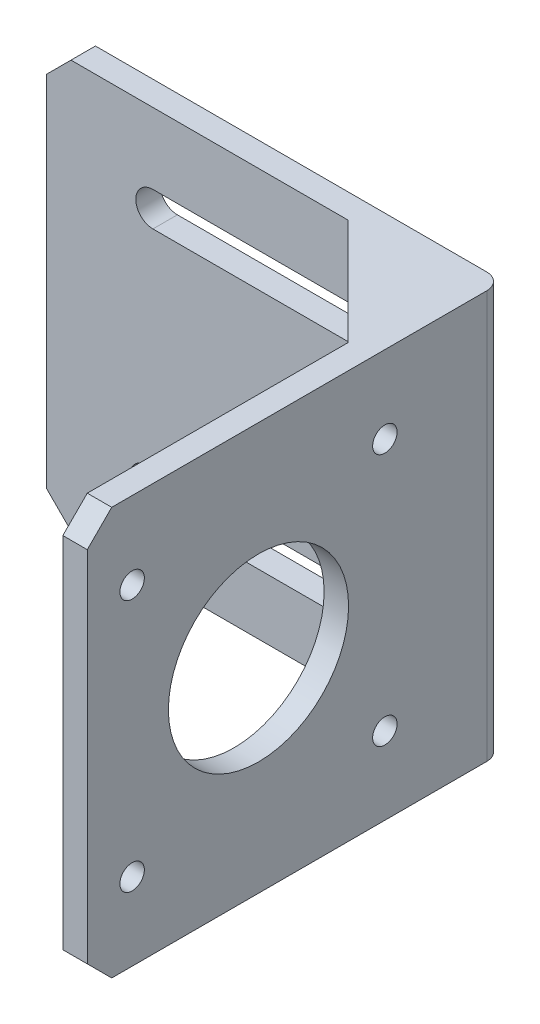
ISO-10303-21;
HEADER;
FILE_DESCRIPTION(('STEP AP214'),'2;1');
FILE_NAME('part.step','',(''),(''),'','','');
FILE_SCHEMA(('AUTOMOTIVE_DESIGN { 1 0 10303 214 1 1 1 1 }'));
ENDSEC;
DATA;
#1=APPLICATION_CONTEXT('core data for automotive mechanical design processes');
#2=APPLICATION_PROTOCOL_DEFINITION('international standard','automotive_design',2000,#1);
#3=PRODUCT_CONTEXT('',#1,'mechanical');
#4=PRODUCT('Part','Part','',(#3));
#5=PRODUCT_RELATED_PRODUCT_CATEGORY('part','',(#4));
#6=PRODUCT_DEFINITION_FORMATION('','',#4);
#7=PRODUCT_DEFINITION_CONTEXT('part definition',#1,'design');
#8=PRODUCT_DEFINITION('design','',#6,#7);
#9=PRODUCT_DEFINITION_SHAPE('','',#8);
#10=(LENGTH_UNIT() NAMED_UNIT(*) SI_UNIT(.MILLI.,.METRE.));
#11=(NAMED_UNIT(*) PLANE_ANGLE_UNIT() SI_UNIT($,.RADIAN.));
#12=(NAMED_UNIT(*) SI_UNIT($,.STERADIAN.) SOLID_ANGLE_UNIT());
#13=UNCERTAINTY_MEASURE_WITH_UNIT(LENGTH_MEASURE(1.E-05),#10,'distance_accuracy_value','');
#14=(GEOMETRIC_REPRESENTATION_CONTEXT(3) GLOBAL_UNCERTAINTY_ASSIGNED_CONTEXT((#13)) GLOBAL_UNIT_ASSIGNED_CONTEXT((#10,
#11,#12)) REPRESENTATION_CONTEXT('',''));
#15=CARTESIAN_POINT('',(0.,0.,0.));
#16=DIRECTION('',(0.,0.,1.));
#17=DIRECTION('',(1.,0.,0.));
#18=AXIS2_PLACEMENT_3D('',#15,#16,#17);
#19=CARTESIAN_POINT('',(0.,0.,3.));
#20=DIRECTION('',(0.,0.,-1.));
#21=DIRECTION('',(-1.,0.,0.));
#22=AXIS2_PLACEMENT_3D('',#19,#20,#21);
#23=PLANE('',#22);
#24=DIRECTION('',(-1.,0.,0.));
#25=VECTOR('',#24,1.);
#26=CARTESIAN_POINT('',(16.5517923782079,16.2937593808742,3.));
#27=LINE('',#26,#25);
#28=CARTESIAN_POINT('',(16.5517923782079,16.2937593808742,3.));
#29=VERTEX_POINT('',#28);
#30=CARTESIAN_POINT('',(-13.4482076217921,16.2937593808742,3.));
#31=VERTEX_POINT('',#30);
#32=EDGE_CURVE('E220',#29,#31,#27,.T.);
#33=ORIENTED_EDGE('',*,*,#32,.F.);
#34=CARTESIAN_POINT('',(16.5517923782079,14.1937593808742,3.));
#35=DIRECTION('',(0.,0.,1.));
#36=DIRECTION('',(1.,0.,0.));
#37=AXIS2_PLACEMENT_3D('',#34,#35,#36);
#38=CIRCLE('',#37,2.1);
#39=CARTESIAN_POINT('',(16.5517923782079,12.0937593808742,3.));
#40=VERTEX_POINT('',#39);
#41=EDGE_CURVE('E51',#40,#29,#38,.T.);
#42=ORIENTED_EDGE('',*,*,#41,.F.);
#43=DIRECTION('',(1.,0.,0.));
#44=VECTOR('',#43,1.);
#45=CARTESIAN_POINT('',(16.5517923782079,12.0937593808742,3.));
#46=LINE('',#45,#44);
#47=CARTESIAN_POINT('',(-13.4482076217921,12.0937593808742,3.));
#48=VERTEX_POINT('',#47);
#49=EDGE_CURVE('E211',#48,#40,#46,.T.);
#50=ORIENTED_EDGE('',*,*,#49,.F.);
#51=CARTESIAN_POINT('',(-13.4482076217921,14.1937593808742,3.));
#52=DIRECTION('',(0.,0.,1.));
#53=DIRECTION('',(1.,0.,0.));
#54=AXIS2_PLACEMENT_3D('',#51,#52,#53);
#55=CIRCLE('',#54,2.1);
#56=EDGE_CURVE('E214',#31,#48,#55,.T.);
#57=ORIENTED_EDGE('',*,*,#56,.F.);
#58=EDGE_LOOP('',(#33,#42,#50,#57));
#59=FACE_BOUND('',#58,.T.);
#60=DIRECTION('',(-1.,0.,0.));
#61=VECTOR('',#60,1.);
#62=CARTESIAN_POINT('',(15.8289488197727,-13.3772342948045,3.));
#63=LINE('',#62,#61);
#64=CARTESIAN_POINT('',(15.8289488197727,-13.3772342948045,3.));
#65=VERTEX_POINT('',#64);
#66=CARTESIAN_POINT('',(-14.1710511802273,-13.3772342948045,3.));
#67=VERTEX_POINT('',#66);
#68=EDGE_CURVE('E246',#65,#67,#63,.T.);
#69=ORIENTED_EDGE('',*,*,#68,.F.);
#70=CARTESIAN_POINT('',(15.8289488197727,-15.4772342948045,3.));
#71=DIRECTION('',(0.,0.,1.));
#72=DIRECTION('',(1.,0.,0.));
#73=AXIS2_PLACEMENT_3D('',#70,#71,#72);
#74=CIRCLE('',#73,2.1);
#75=CARTESIAN_POINT('',(15.8289488197727,-17.5772342948045,3.));
#76=VERTEX_POINT('',#75);
#77=EDGE_CURVE('E59',#76,#65,#74,.T.);
#78=ORIENTED_EDGE('',*,*,#77,.F.);
#79=DIRECTION('',(1.,0.,0.));
#80=VECTOR('',#79,1.);
#81=CARTESIAN_POINT('',(15.8289488197727,-17.5772342948045,3.));
#82=LINE('',#81,#80);
#83=CARTESIAN_POINT('',(-14.1710511802273,-17.5772342948045,3.));
#84=VERTEX_POINT('',#83);
#85=EDGE_CURVE('E235',#84,#76,#82,.T.);
#86=ORIENTED_EDGE('',*,*,#85,.F.);
#87=CARTESIAN_POINT('',(-14.1710511802273,-15.4772342948045,3.));
#88=DIRECTION('',(0.,0.,1.));
#89=DIRECTION('',(1.,0.,0.));
#90=AXIS2_PLACEMENT_3D('',#87,#88,#89);
#91=CIRCLE('',#90,2.1);
#92=EDGE_CURVE('E249',#67,#84,#91,.T.);
#93=ORIENTED_EDGE('',*,*,#92,.F.);
#94=EDGE_LOOP('',(#69,#78,#86,#93));
#95=FACE_BOUND('',#94,.T.);
#96=DIRECTION('',(1.,0.,0.));
#97=VECTOR('',#96,1.);
#98=CARTESIAN_POINT('',(-26.5,-25.,3.));
#99=LINE('',#98,#97);
#100=CARTESIAN_POINT('',(-23.5,-25.,3.));
#101=VERTEX_POINT('',#100);
#102=CARTESIAN_POINT('',(10.5,-25.,3.));
#103=VERTEX_POINT('',#102);
#104=EDGE_CURVE('E341',#101,#103,#99,.T.);
#105=ORIENTED_EDGE('',*,*,#104,.T.);
#106=DIRECTION('',(0.,-1.,0.));
#107=VECTOR('',#106,1.);
#108=CARTESIAN_POINT('',(10.5,-22.,3.));
#109=LINE('',#108,#107);
#110=CARTESIAN_POINT('',(10.5,-22.,3.));
#111=VERTEX_POINT('',#110);
#112=EDGE_CURVE('E272',#111,#103,#109,.T.);
#113=ORIENTED_EDGE('',*,*,#112,.F.);
#114=DIRECTION('',(1.,0.,0.));
#115=VECTOR('',#114,1.);
#116=CARTESIAN_POINT('',(10.5,-22.,3.));
#117=LINE('',#116,#115);
#118=CARTESIAN_POINT('',(23.5,-22.,3.));
#119=VERTEX_POINT('',#118);
#120=EDGE_CURVE('E260',#111,#119,#117,.T.);
#121=ORIENTED_EDGE('',*,*,#120,.T.);
#122=DIRECTION('',(0.,-1.,0.));
#123=VECTOR('',#122,1.);
#124=CARTESIAN_POINT('',(23.5,-25.,3.));
#125=LINE('',#124,#123);
#126=CARTESIAN_POINT('',(23.5,22.,3.));
#127=VERTEX_POINT('',#126);
#128=EDGE_CURVE('E321',#127,#119,#125,.T.);
#129=ORIENTED_EDGE('',*,*,#128,.F.);
#130=DIRECTION('',(-1.,0.,0.));
#131=VECTOR('',#130,1.);
#132=CARTESIAN_POINT('',(10.5,22.,3.));
#133=LINE('',#132,#131);
#134=CARTESIAN_POINT('',(10.5,22.,3.));
#135=VERTEX_POINT('',#134);
#136=EDGE_CURVE('E279',#127,#135,#133,.T.);
#137=ORIENTED_EDGE('',*,*,#136,.T.);
#138=DIRECTION('',(0.,1.,0.));
#139=VECTOR('',#138,1.);
#140=CARTESIAN_POINT('',(10.5,22.,3.));
#141=LINE('',#140,#139);
#142=CARTESIAN_POINT('',(10.5,25.,3.));
#143=VERTEX_POINT('',#142);
#144=EDGE_CURVE('E284',#135,#143,#141,.T.);
#145=ORIENTED_EDGE('',*,*,#144,.T.);
#146=DIRECTION('',(-1.,0.,0.));
#147=VECTOR('',#146,1.);
#148=CARTESIAN_POINT('',(-26.5,25.,3.));
#149=LINE('',#148,#147);
#150=CARTESIAN_POINT('',(-23.5,25.,3.));
#151=VERTEX_POINT('',#150);
#152=EDGE_CURVE('E335',#143,#151,#149,.T.);
#153=ORIENTED_EDGE('',*,*,#152,.T.);
#154=DIRECTION('',(0.707106781186548,0.707106781186548,0.));
#155=VECTOR('',#154,1.);
#156=CARTESIAN_POINT('',(-26.5,22.,3.));
#157=LINE('',#156,#155);
#158=CARTESIAN_POINT('',(-26.5,22.,3.));
#159=VERTEX_POINT('',#158);
#160=EDGE_CURVE('E379',#151,#159,#157,.F.);
#161=ORIENTED_EDGE('',*,*,#160,.T.);
#162=DIRECTION('',(0.,-1.,0.));
#163=VECTOR('',#162,1.);
#164=CARTESIAN_POINT('',(-26.5,-25.,3.));
#165=LINE('',#164,#163);
#166=CARTESIAN_POINT('',(-26.5,-22.,3.));
#167=VERTEX_POINT('',#166);
#168=EDGE_CURVE('E337',#159,#167,#165,.T.);
#169=ORIENTED_EDGE('',*,*,#168,.T.);
#170=DIRECTION('',(-0.707106781186548,0.707106781186548,0.));
#171=VECTOR('',#170,1.);
#172=CARTESIAN_POINT('',(-23.5,-25.,3.));
#173=LINE('',#172,#171);
#174=EDGE_CURVE('E381',#167,#101,#173,.F.);
#175=ORIENTED_EDGE('',*,*,#174,.T.);
#176=EDGE_LOOP('',(#105,#113,#121,#129,#137,#145,#153,#161,#169,#175));
#177=FACE_BOUND('',#176,.T.);
#178=ADVANCED_FACE('F36',(#59,#95,#177),#23,.F.);
#179=CARTESIAN_POINT('',(26.5,-25.,3.));
#180=DIRECTION('',(-1.,0.,0.));
#181=DIRECTION('',(0.,0.,1.));
#182=AXIS2_PLACEMENT_3D('',#179,#180,#181);
#183=PLANE('',#182);
#184=CARTESIAN_POINT('',(26.5,15.5,14.5));
#185=DIRECTION('',(1.,0.,0.));
#186=DIRECTION('',(0.,0.,-1.));
#187=AXIS2_PLACEMENT_3D('',#184,#185,#186);
#188=CIRCLE('',#187,1.5);
#189=CARTESIAN_POINT('',(26.5,15.5,13.));
#190=VERTEX_POINT('',#189);
#191=EDGE_CURVE('E290',#190,#190,#188,.T.);
#192=ORIENTED_EDGE('',*,*,#191,.F.);
#193=EDGE_LOOP('',(#192));
#194=FACE_BOUND('',#193,.T.);
#195=CARTESIAN_POINT('',(26.5,-15.5,14.5));
#196=DIRECTION('',(1.,0.,0.));
#197=DIRECTION('',(0.,0.,-1.));
#198=AXIS2_PLACEMENT_3D('',#195,#196,#197);
#199=CIRCLE('',#198,1.5);
#200=CARTESIAN_POINT('',(26.5,-15.5,13.));
#201=VERTEX_POINT('',#200);
#202=EDGE_CURVE('E297',#201,#201,#199,.T.);
#203=ORIENTED_EDGE('',*,*,#202,.F.);
#204=EDGE_LOOP('',(#203));
#205=FACE_BOUND('',#204,.T.);
#206=CARTESIAN_POINT('',(26.5,-15.5,45.5));
#207=DIRECTION('',(1.,0.,0.));
#208=DIRECTION('',(0.,0.,-1.));
#209=AXIS2_PLACEMENT_3D('',#206,#207,#208);
#210=CIRCLE('',#209,1.5);
#211=CARTESIAN_POINT('',(26.5,-15.5,44.));
#212=VERTEX_POINT('',#211);
#213=EDGE_CURVE('E303',#212,#212,#210,.T.);
#214=ORIENTED_EDGE('',*,*,#213,.F.);
#215=EDGE_LOOP('',(#214));
#216=FACE_BOUND('',#215,.T.);
#217=CARTESIAN_POINT('',(26.5,15.5,45.5));
#218=DIRECTION('',(1.,0.,0.));
#219=DIRECTION('',(0.,0.,-1.));
#220=AXIS2_PLACEMENT_3D('',#217,#218,#219);
#221=CIRCLE('',#220,1.5);
#222=CARTESIAN_POINT('',(26.5,15.5,44.));
#223=VERTEX_POINT('',#222);
#224=EDGE_CURVE('E309',#223,#223,#221,.T.);
#225=ORIENTED_EDGE('',*,*,#224,.F.);
#226=EDGE_LOOP('',(#225));
#227=FACE_BOUND('',#226,.T.);
#228=CARTESIAN_POINT('',(26.5,0.,30.));
#229=DIRECTION('',(1.,0.,0.));
#230=DIRECTION('',(0.,0.,-1.));
#231=AXIS2_PLACEMENT_3D('',#228,#229,#230);
#232=CIRCLE('',#231,11.05);
#233=CARTESIAN_POINT('',(26.5,0.,18.95));
#234=VERTEX_POINT('',#233);
#235=EDGE_CURVE('E315',#234,#234,#232,.T.);
#236=ORIENTED_EDGE('',*,*,#235,.F.);
#237=EDGE_LOOP('',(#236));
#238=FACE_BOUND('',#237,.T.);
#239=DIRECTION('',(0.,0.,-1.));
#240=VECTOR('',#239,1.);
#241=CARTESIAN_POINT('',(26.5,25.,3.));
#242=LINE('',#241,#240);
#243=CARTESIAN_POINT('',(26.5,25.,48.));
#244=VERTEX_POINT('',#243);
#245=CARTESIAN_POINT('',(26.5,25.,2.));
#246=VERTEX_POINT('',#245);
#247=EDGE_CURVE('E352',#244,#246,#242,.T.);
#248=ORIENTED_EDGE('',*,*,#247,.F.);
#249=DIRECTION('',(0.,-0.707106781186546,0.707106781186549));
#250=VECTOR('',#249,1.);
#251=CARTESIAN_POINT('',(26.5,22.,51.));
#252=LINE('',#251,#250);
#253=CARTESIAN_POINT('',(26.5,22.,51.));
#254=VERTEX_POINT('',#253);
#255=EDGE_CURVE('E11',#244,#254,#252,.T.);
#256=ORIENTED_EDGE('',*,*,#255,.T.);
#257=DIRECTION('',(0.,1.,0.));
#258=VECTOR('',#257,1.);
#259=CARTESIAN_POINT('',(26.5,-25.,51.));
#260=LINE('',#259,#258);
#261=CARTESIAN_POINT('',(26.5,-22.,51.));
#262=VERTEX_POINT('',#261);
#263=EDGE_CURVE('E322',#262,#254,#260,.T.);
#264=ORIENTED_EDGE('',*,*,#263,.F.);
#265=DIRECTION('',(0.,-0.707106781186546,-0.707106781186549));
#266=VECTOR('',#265,1.);
#267=CARTESIAN_POINT('',(26.5,-22.,51.));
#268=LINE('',#267,#266);
#269=CARTESIAN_POINT('',(26.5,-25.,48.));
#270=VERTEX_POINT('',#269);
#271=EDGE_CURVE('E389',#262,#270,#268,.T.);
#272=ORIENTED_EDGE('',*,*,#271,.T.);
#273=DIRECTION('',(0.,0.,-1.));
#274=VECTOR('',#273,1.);
#275=CARTESIAN_POINT('',(26.5,-25.,3.));
#276=LINE('',#275,#274);
#277=CARTESIAN_POINT('',(26.5,-25.,2.));
#278=VERTEX_POINT('',#277);
#279=EDGE_CURVE('E344',#270,#278,#276,.T.);
#280=ORIENTED_EDGE('',*,*,#279,.T.);
#281=DIRECTION('',(0.,1.,0.));
#282=VECTOR('',#281,1.);
#283=CARTESIAN_POINT('',(26.5,25.,2.));
#284=LINE('',#283,#282);
#285=EDGE_CURVE('E354',#278,#246,#284,.T.);
#286=ORIENTED_EDGE('',*,*,#285,.T.);
#287=EDGE_LOOP('',(#248,#256,#264,#272,#280,#286));
#288=FACE_BOUND('',#287,.T.);
#289=ADVANCED_FACE('F408',(#194,#205,#216,#227,#238,#288),#183,.F.);
#290=CARTESIAN_POINT('',(-26.5,25.,3.));
#291=DIRECTION('',(0.,-1.,0.));
#292=DIRECTION('',(0.,0.,-1.));
#293=AXIS2_PLACEMENT_3D('',#290,#291,#292);
#294=PLANE('',#293);
#295=ORIENTED_EDGE('',*,*,#152,.F.);
#296=DIRECTION('',(0.707106781186547,0.,0.707106781186548));
#297=VECTOR('',#296,1.);
#298=CARTESIAN_POINT('',(23.5,25.,16.));
#299=LINE('',#298,#297);
#300=CARTESIAN_POINT('',(23.5,25.,16.));
#301=VERTEX_POINT('',#300);
#302=EDGE_CURVE('E274',#143,#301,#299,.T.);
#303=ORIENTED_EDGE('',*,*,#302,.T.);
#304=DIRECTION('',(0.,0.,-1.));
#305=VECTOR('',#304,1.);
#306=CARTESIAN_POINT('',(23.5,25.,51.));
#307=LINE('',#306,#305);
#308=CARTESIAN_POINT('',(23.5,25.,48.));
#309=VERTEX_POINT('',#308);
#310=EDGE_CURVE('E332',#309,#301,#307,.T.);
#311=ORIENTED_EDGE('',*,*,#310,.F.);
#312=DIRECTION('',(1.,0.,0.));
#313=VECTOR('',#312,1.);
#314=CARTESIAN_POINT('',(26.5,25.,48.));
#315=LINE('',#314,#313);
#316=EDGE_CURVE('E44',#309,#244,#315,.T.);
#317=ORIENTED_EDGE('',*,*,#316,.T.);
#318=ORIENTED_EDGE('',*,*,#247,.T.);
#319=CARTESIAN_POINT('',(24.5,25.,2.));
#320=DIRECTION('',(0.,-1.,0.));
#321=DIRECTION('',(0.,0.,-1.));
#322=AXIS2_PLACEMENT_3D('',#319,#320,#321);
#323=CIRCLE('',#322,2.);
#324=CARTESIAN_POINT('',(24.5,25.,0.));
#325=VERTEX_POINT('',#324);
#326=EDGE_CURVE('E357',#246,#325,#323,.F.);
#327=ORIENTED_EDGE('',*,*,#326,.T.);
#328=DIRECTION('',(-1.,0.,0.));
#329=VECTOR('',#328,1.);
#330=CARTESIAN_POINT('',(-26.5,25.,0.));
#331=LINE('',#330,#329);
#332=CARTESIAN_POINT('',(-23.5,25.,0.));
#333=VERTEX_POINT('',#332);
#334=EDGE_CURVE('E334',#325,#333,#331,.T.);
#335=ORIENTED_EDGE('',*,*,#334,.T.);
#336=DIRECTION('',(0.,0.,1.));
#337=VECTOR('',#336,1.);
#338=CARTESIAN_POINT('',(-23.5,25.,3.));
#339=LINE('',#338,#337);
#340=EDGE_CURVE('E383',#333,#151,#339,.T.);
#341=ORIENTED_EDGE('',*,*,#340,.T.);
#342=EDGE_LOOP('',(#295,#303,#311,#317,#318,#327,#335,#341));
#343=FACE_BOUND('',#342,.T.);
#344=ADVANCED_FACE('F403',(#343),#294,.F.);
#345=CARTESIAN_POINT('',(-26.5,-25.,3.));
#346=DIRECTION('',(1.,0.,0.));
#347=DIRECTION('',(0.,0.,-1.));
#348=AXIS2_PLACEMENT_3D('',#345,#346,#347);
#349=PLANE('',#348);
#350=DIRECTION('',(0.,-1.,0.));
#351=VECTOR('',#350,1.);
#352=CARTESIAN_POINT('',(-26.5,-25.,0.));
#353=LINE('',#352,#351);
#354=CARTESIAN_POINT('',(-26.5,22.,0.));
#355=VERTEX_POINT('',#354);
#356=CARTESIAN_POINT('',(-26.5,-22.,0.));
#357=VERTEX_POINT('',#356);
#358=EDGE_CURVE('E347',#355,#357,#353,.T.);
#359=ORIENTED_EDGE('',*,*,#358,.T.);
#360=DIRECTION('',(0.,0.,1.));
#361=VECTOR('',#360,1.);
#362=CARTESIAN_POINT('',(-26.5,-22.,3.));
#363=LINE('',#362,#361);
#364=EDGE_CURVE('E377',#357,#167,#363,.T.);
#365=ORIENTED_EDGE('',*,*,#364,.T.);
#366=ORIENTED_EDGE('',*,*,#168,.F.);
#367=DIRECTION('',(0.,0.,-1.));
#368=VECTOR('',#367,1.);
#369=CARTESIAN_POINT('',(-26.5,22.,3.));
#370=LINE('',#369,#368);
#371=EDGE_CURVE('E374',#159,#355,#370,.T.);
#372=ORIENTED_EDGE('',*,*,#371,.T.);
#373=EDGE_LOOP('',(#359,#365,#366,#372));
#374=FACE_BOUND('',#373,.T.);
#375=ADVANCED_FACE('F442',(#374),#349,.F.);
#376=CARTESIAN_POINT('',(-26.5,-25.,3.));
#377=DIRECTION('',(0.,1.,0.));
#378=DIRECTION('',(0.,0.,1.));
#379=AXIS2_PLACEMENT_3D('',#376,#377,#378);
#380=PLANE('',#379);
#381=ORIENTED_EDGE('',*,*,#104,.F.);
#382=DIRECTION('',(0.,0.,-1.));
#383=VECTOR('',#382,1.);
#384=CARTESIAN_POINT('',(-23.5,-25.,3.));
#385=LINE('',#384,#383);
#386=CARTESIAN_POINT('',(-23.5,-25.,0.));
#387=VERTEX_POINT('',#386);
#388=EDGE_CURVE('E367',#101,#387,#385,.T.);
#389=ORIENTED_EDGE('',*,*,#388,.T.);
#390=DIRECTION('',(1.,0.,0.));
#391=VECTOR('',#390,1.);
#392=CARTESIAN_POINT('',(-26.5,-25.,0.));
#393=LINE('',#392,#391);
#394=CARTESIAN_POINT('',(24.5,-25.,0.));
#395=VERTEX_POINT('',#394);
#396=EDGE_CURVE('E338',#387,#395,#393,.T.);
#397=ORIENTED_EDGE('',*,*,#396,.T.);
#398=CARTESIAN_POINT('',(24.5,-25.,2.));
#399=DIRECTION('',(0.,1.,0.));
#400=DIRECTION('',(0.,0.,1.));
#401=AXIS2_PLACEMENT_3D('',#398,#399,#400);
#402=CIRCLE('',#401,2.);
#403=EDGE_CURVE('E362',#395,#278,#402,.F.);
#404=ORIENTED_EDGE('',*,*,#403,.T.);
#405=ORIENTED_EDGE('',*,*,#279,.F.);
#406=DIRECTION('',(-1.,0.,0.));
#407=VECTOR('',#406,1.);
#408=CARTESIAN_POINT('',(23.5,-25.,48.));
#409=LINE('',#408,#407);
#410=CARTESIAN_POINT('',(23.5,-25.,48.));
#411=VERTEX_POINT('',#410);
#412=EDGE_CURVE('E365',#270,#411,#409,.T.);
#413=ORIENTED_EDGE('',*,*,#412,.T.);
#414=DIRECTION('',(0.,0.,-1.));
#415=VECTOR('',#414,1.);
#416=CARTESIAN_POINT('',(23.5,-25.,51.));
#417=LINE('',#416,#415);
#418=CARTESIAN_POINT('',(23.5,-25.,16.));
#419=VERTEX_POINT('',#418);
#420=EDGE_CURVE('E327',#411,#419,#417,.T.);
#421=ORIENTED_EDGE('',*,*,#420,.T.);
#422=DIRECTION('',(-0.707106781186547,0.,-0.707106781186548));
#423=VECTOR('',#422,1.);
#424=CARTESIAN_POINT('',(23.5,-25.,16.));
#425=LINE('',#424,#423);
#426=EDGE_CURVE('E227',#419,#103,#425,.T.);
#427=ORIENTED_EDGE('',*,*,#426,.T.);
#428=EDGE_LOOP('',(#381,#389,#397,#404,#405,#413,#421,#427));
#429=FACE_BOUND('',#428,.T.);
#430=ADVANCED_FACE('F426',(#429),#380,.F.);
#431=CARTESIAN_POINT('',(0.,0.,0.));
#432=DIRECTION('',(0.,0.,-1.));
#433=DIRECTION('',(-1.,0.,0.));
#434=AXIS2_PLACEMENT_3D('',#431,#432,#433);
#435=PLANE('',#434);
#436=CARTESIAN_POINT('',(16.5517923782079,14.1937593808742,0.));
#437=DIRECTION('',(0.,0.,1.));
#438=DIRECTION('',(1.,0.,0.));
#439=AXIS2_PLACEMENT_3D('',#436,#437,#438);
#440=CIRCLE('',#439,2.1);
#441=CARTESIAN_POINT('',(16.5517923782079,12.0937593808742,0.));
#442=VERTEX_POINT('',#441);
#443=CARTESIAN_POINT('',(16.5517923782079,16.2937593808742,0.));
#444=VERTEX_POINT('',#443);
#445=EDGE_CURVE('E192',#442,#444,#440,.T.);
#446=ORIENTED_EDGE('',*,*,#445,.T.);
#447=DIRECTION('',(-1.,0.,0.));
#448=VECTOR('',#447,1.);
#449=CARTESIAN_POINT('',(16.5517923782079,16.2937593808742,0.));
#450=LINE('',#449,#448);
#451=CARTESIAN_POINT('',(-13.4482076217921,16.2937593808742,0.));
#452=VERTEX_POINT('',#451);
#453=EDGE_CURVE('E202',#444,#452,#450,.T.);
#454=ORIENTED_EDGE('',*,*,#453,.T.);
#455=CARTESIAN_POINT('',(-13.4482076217921,14.1937593808742,0.));
#456=DIRECTION('',(0.,0.,1.));
#457=DIRECTION('',(1.,0.,0.));
#458=AXIS2_PLACEMENT_3D('',#455,#456,#457);
#459=CIRCLE('',#458,2.1);
#460=CARTESIAN_POINT('',(-13.4482076217921,12.0937593808742,0.));
#461=VERTEX_POINT('',#460);
#462=EDGE_CURVE('E206',#452,#461,#459,.T.);
#463=ORIENTED_EDGE('',*,*,#462,.T.);
#464=DIRECTION('',(1.,0.,0.));
#465=VECTOR('',#464,1.);
#466=CARTESIAN_POINT('',(16.5517923782079,12.0937593808742,0.));
#467=LINE('',#466,#465);
#468=EDGE_CURVE('E198',#461,#442,#467,.T.);
#469=ORIENTED_EDGE('',*,*,#468,.T.);
#470=EDGE_LOOP('',(#446,#454,#463,#469));
#471=FACE_BOUND('',#470,.T.);
#472=CARTESIAN_POINT('',(15.8289488197727,-15.4772342948045,0.));
#473=DIRECTION('',(0.,0.,1.));
#474=DIRECTION('',(1.,0.,0.));
#475=AXIS2_PLACEMENT_3D('',#472,#473,#474);
#476=CIRCLE('',#475,2.1);
#477=CARTESIAN_POINT('',(15.8289488197727,-17.5772342948045,0.));
#478=VERTEX_POINT('',#477);
#479=CARTESIAN_POINT('',(15.8289488197727,-13.3772342948045,0.));
#480=VERTEX_POINT('',#479);
#481=EDGE_CURVE('E231',#478,#480,#476,.T.);
#482=ORIENTED_EDGE('',*,*,#481,.T.);
#483=DIRECTION('',(-1.,0.,0.));
#484=VECTOR('',#483,1.);
#485=CARTESIAN_POINT('',(15.8289488197727,-13.3772342948045,0.));
#486=LINE('',#485,#484);
#487=CARTESIAN_POINT('',(-14.1710511802273,-13.3772342948045,0.));
#488=VERTEX_POINT('',#487);
#489=EDGE_CURVE('E234',#480,#488,#486,.T.);
#490=ORIENTED_EDGE('',*,*,#489,.T.);
#491=CARTESIAN_POINT('',(-14.1710511802273,-15.4772342948045,0.));
#492=DIRECTION('',(0.,0.,1.));
#493=DIRECTION('',(1.,0.,0.));
#494=AXIS2_PLACEMENT_3D('',#491,#492,#493);
#495=CIRCLE('',#494,2.1);
#496=CARTESIAN_POINT('',(-14.1710511802273,-17.5772342948045,0.));
#497=VERTEX_POINT('',#496);
#498=EDGE_CURVE('E238',#488,#497,#495,.T.);
#499=ORIENTED_EDGE('',*,*,#498,.T.);
#500=DIRECTION('',(1.,0.,0.));
#501=VECTOR('',#500,1.);
#502=CARTESIAN_POINT('',(15.8289488197727,-17.5772342948045,0.));
#503=LINE('',#502,#501);
#504=EDGE_CURVE('E241',#497,#478,#503,.T.);
#505=ORIENTED_EDGE('',*,*,#504,.T.);
#506=EDGE_LOOP('',(#482,#490,#499,#505));
#507=FACE_BOUND('',#506,.T.);
#508=ORIENTED_EDGE('',*,*,#396,.F.);
#509=DIRECTION('',(0.707106781186548,-0.707106781186548,0.));
#510=VECTOR('',#509,1.);
#511=CARTESIAN_POINT('',(-24.25,-24.25,0.));
#512=LINE('',#511,#510);
#513=EDGE_CURVE('E372',#387,#357,#512,.F.);
#514=ORIENTED_EDGE('',*,*,#513,.T.);
#515=ORIENTED_EDGE('',*,*,#358,.F.);
#516=DIRECTION('',(-0.707106781186548,-0.707106781186548,0.));
#517=VECTOR('',#516,1.);
#518=CARTESIAN_POINT('',(-24.25,24.25,0.));
#519=LINE('',#518,#517);
#520=EDGE_CURVE('E370',#355,#333,#519,.F.);
#521=ORIENTED_EDGE('',*,*,#520,.T.);
#522=ORIENTED_EDGE('',*,*,#334,.F.);
#523=DIRECTION('',(0.,1.,0.));
#524=VECTOR('',#523,1.);
#525=CARTESIAN_POINT('',(24.5,-25.,0.));
#526=LINE('',#525,#524);
#527=EDGE_CURVE('E359',#325,#395,#526,.F.);
#528=ORIENTED_EDGE('',*,*,#527,.T.);
#529=EDGE_LOOP('',(#508,#514,#515,#521,#522,#528));
#530=FACE_BOUND('',#529,.T.);
#531=ADVANCED_FACE('F208',(#471,#507,#530),#435,.T.);
#532=CARTESIAN_POINT('',(23.5,-25.,51.));
#533=DIRECTION('',(1.,0.,0.));
#534=DIRECTION('',(0.,0.,-1.));
#535=AXIS2_PLACEMENT_3D('',#532,#533,#534);
#536=PLANE('',#535);
#537=CARTESIAN_POINT('',(23.5,15.5,14.5));
#538=DIRECTION('',(1.,0.,0.));
#539=DIRECTION('',(0.,0.,-1.));
#540=AXIS2_PLACEMENT_3D('',#537,#538,#539);
#541=CIRCLE('',#540,1.5);
#542=CARTESIAN_POINT('',(23.5,15.5,13.));
#543=VERTEX_POINT('',#542);
#544=EDGE_CURVE('E294',#543,#543,#541,.F.);
#545=ORIENTED_EDGE('',*,*,#544,.F.);
#546=EDGE_LOOP('',(#545));
#547=FACE_BOUND('',#546,.T.);
#548=CARTESIAN_POINT('',(23.5,-15.5,14.5));
#549=DIRECTION('',(1.,0.,0.));
#550=DIRECTION('',(0.,0.,-1.));
#551=AXIS2_PLACEMENT_3D('',#548,#549,#550);
#552=CIRCLE('',#551,1.5);
#553=CARTESIAN_POINT('',(23.5,-15.5,13.));
#554=VERTEX_POINT('',#553);
#555=EDGE_CURVE('E300',#554,#554,#552,.F.);
#556=ORIENTED_EDGE('',*,*,#555,.F.);
#557=EDGE_LOOP('',(#556));
#558=FACE_BOUND('',#557,.T.);
#559=CARTESIAN_POINT('',(23.5,-15.5,45.5));
#560=DIRECTION('',(1.,0.,0.));
#561=DIRECTION('',(0.,0.,-1.));
#562=AXIS2_PLACEMENT_3D('',#559,#560,#561);
#563=CIRCLE('',#562,1.5);
#564=CARTESIAN_POINT('',(23.5,-15.5,44.));
#565=VERTEX_POINT('',#564);
#566=EDGE_CURVE('E306',#565,#565,#563,.F.);
#567=ORIENTED_EDGE('',*,*,#566,.F.);
#568=EDGE_LOOP('',(#567));
#569=FACE_BOUND('',#568,.T.);
#570=CARTESIAN_POINT('',(23.5,15.5,45.5));
#571=DIRECTION('',(1.,0.,0.));
#572=DIRECTION('',(0.,0.,-1.));
#573=AXIS2_PLACEMENT_3D('',#570,#571,#572);
#574=CIRCLE('',#573,1.5);
#575=CARTESIAN_POINT('',(23.5,15.5,44.));
#576=VERTEX_POINT('',#575);
#577=EDGE_CURVE('E312',#576,#576,#574,.F.);
#578=ORIENTED_EDGE('',*,*,#577,.F.);
#579=EDGE_LOOP('',(#578));
#580=FACE_BOUND('',#579,.T.);
#581=CARTESIAN_POINT('',(23.5,0.,30.));
#582=DIRECTION('',(1.,0.,0.));
#583=DIRECTION('',(0.,0.,-1.));
#584=AXIS2_PLACEMENT_3D('',#581,#582,#583);
#585=CIRCLE('',#584,11.05);
#586=CARTESIAN_POINT('',(23.5,0.,18.95));
#587=VERTEX_POINT('',#586);
#588=EDGE_CURVE('E318',#587,#587,#585,.F.);
#589=ORIENTED_EDGE('',*,*,#588,.F.);
#590=EDGE_LOOP('',(#589));
#591=FACE_BOUND('',#590,.T.);
#592=DIRECTION('',(0.,0.,1.));
#593=VECTOR('',#592,1.);
#594=CARTESIAN_POINT('',(23.5,-22.,3.));
#595=LINE('',#594,#593);
#596=CARTESIAN_POINT('',(23.5,-22.,16.));
#597=VERTEX_POINT('',#596);
#598=EDGE_CURVE('E263',#119,#597,#595,.T.);
#599=ORIENTED_EDGE('',*,*,#598,.T.);
#600=DIRECTION('',(0.,-1.,0.));
#601=VECTOR('',#600,1.);
#602=CARTESIAN_POINT('',(23.5,-22.,16.));
#603=LINE('',#602,#601);
#604=EDGE_CURVE('E269',#597,#419,#603,.T.);
#605=ORIENTED_EDGE('',*,*,#604,.T.);
#606=ORIENTED_EDGE('',*,*,#420,.F.);
#607=DIRECTION('',(0.,0.707106781186546,0.707106781186549));
#608=VECTOR('',#607,1.);
#609=CARTESIAN_POINT('',(23.5,-22.,51.));
#610=LINE('',#609,#608);
#611=CARTESIAN_POINT('',(23.5,-22.,51.));
#612=VERTEX_POINT('',#611);
#613=EDGE_CURVE('E391',#411,#612,#610,.T.);
#614=ORIENTED_EDGE('',*,*,#613,.T.);
#615=DIRECTION('',(0.,-1.,0.));
#616=VECTOR('',#615,1.);
#617=CARTESIAN_POINT('',(23.5,-25.,51.));
#618=LINE('',#617,#616);
#619=CARTESIAN_POINT('',(23.5,22.,51.));
#620=VERTEX_POINT('',#619);
#621=EDGE_CURVE('E325',#620,#612,#618,.T.);
#622=ORIENTED_EDGE('',*,*,#621,.F.);
#623=DIRECTION('',(0.,0.707106781186546,-0.707106781186549));
#624=VECTOR('',#623,1.);
#625=CARTESIAN_POINT('',(23.5,22.,51.));
#626=LINE('',#625,#624);
#627=EDGE_CURVE('E397',#620,#309,#626,.T.);
#628=ORIENTED_EDGE('',*,*,#627,.T.);
#629=ORIENTED_EDGE('',*,*,#310,.T.);
#630=DIRECTION('',(0.,1.,0.));
#631=VECTOR('',#630,1.);
#632=CARTESIAN_POINT('',(23.5,22.,16.));
#633=LINE('',#632,#631);
#634=CARTESIAN_POINT('',(23.5,22.,16.));
#635=VERTEX_POINT('',#634);
#636=EDGE_CURVE('E287',#635,#301,#633,.T.);
#637=ORIENTED_EDGE('',*,*,#636,.F.);
#638=DIRECTION('',(0.,0.,-1.));
#639=VECTOR('',#638,1.);
#640=CARTESIAN_POINT('',(23.5,22.,3.));
#641=LINE('',#640,#639);
#642=EDGE_CURVE('E277',#635,#127,#641,.T.);
#643=ORIENTED_EDGE('',*,*,#642,.T.);
#644=ORIENTED_EDGE('',*,*,#128,.T.);
#645=EDGE_LOOP('',(#599,#605,#606,#614,#622,#628,#629,#637,#643,#644));
#646=FACE_BOUND('',#645,.T.);
#647=ADVANCED_FACE('F416',(#547,#558,#569,#580,#591,#646),#536,.F.);
#648=CARTESIAN_POINT('',(0.,0.,51.));
#649=DIRECTION('',(0.,0.,1.));
#650=DIRECTION('',(1.,0.,0.));
#651=AXIS2_PLACEMENT_3D('',#648,#649,#650);
#652=PLANE('',#651);
#653=ORIENTED_EDGE('',*,*,#263,.T.);
#654=DIRECTION('',(-1.,0.,0.));
#655=VECTOR('',#654,1.);
#656=CARTESIAN_POINT('',(23.5,22.,51.));
#657=LINE('',#656,#655);
#658=EDGE_CURVE('E394',#254,#620,#657,.T.);
#659=ORIENTED_EDGE('',*,*,#658,.T.);
#660=ORIENTED_EDGE('',*,*,#621,.T.);
#661=DIRECTION('',(1.,0.,0.));
#662=VECTOR('',#661,1.);
#663=CARTESIAN_POINT('',(26.5,-22.,51.));
#664=LINE('',#663,#662);
#665=EDGE_CURVE('E386',#612,#262,#664,.T.);
#666=ORIENTED_EDGE('',*,*,#665,.T.);
#667=EDGE_LOOP('',(#653,#659,#660,#666));
#668=FACE_BOUND('',#667,.T.);
#669=ADVANCED_FACE('F414',(#668),#652,.T.);
#670=CARTESIAN_POINT('',(24.5,-25.,2.));
#671=DIRECTION('',(0.,-1.,0.));
#672=DIRECTION('',(0.,0.,-1.));
#673=AXIS2_PLACEMENT_3D('',#670,#671,#672);
#674=CYLINDRICAL_SURFACE('',#673,2.);
#675=ORIENTED_EDGE('',*,*,#403,.F.);
#676=ORIENTED_EDGE('',*,*,#527,.F.);
#677=ORIENTED_EDGE('',*,*,#326,.F.);
#678=ORIENTED_EDGE('',*,*,#285,.F.);
#679=EDGE_LOOP('',(#675,#676,#677,#678));
#680=FACE_BOUND('',#679,.T.);
#681=ADVANCED_FACE('F431',(#680),#674,.T.);
#682=CARTESIAN_POINT('',(-23.5,-25.,3.));
#683=DIRECTION('',(0.707106781186547,0.707106781186547,0.));
#684=DIRECTION('',(0.,0.,-1.));
#685=AXIS2_PLACEMENT_3D('',#682,#683,#684);
#686=PLANE('',#685);
#687=ORIENTED_EDGE('',*,*,#174,.F.);
#688=ORIENTED_EDGE('',*,*,#364,.F.);
#689=ORIENTED_EDGE('',*,*,#513,.F.);
#690=ORIENTED_EDGE('',*,*,#388,.F.);
#691=EDGE_LOOP('',(#687,#688,#689,#690));
#692=FACE_BOUND('',#691,.T.);
#693=ADVANCED_FACE('F448',(#692),#686,.F.);
#694=CARTESIAN_POINT('',(-26.5,22.,3.));
#695=DIRECTION('',(0.707106781186547,-0.707106781186547,0.));
#696=DIRECTION('',(0.,0.,-1.));
#697=AXIS2_PLACEMENT_3D('',#694,#695,#696);
#698=PLANE('',#697);
#699=ORIENTED_EDGE('',*,*,#160,.F.);
#700=ORIENTED_EDGE('',*,*,#340,.F.);
#701=ORIENTED_EDGE('',*,*,#520,.F.);
#702=ORIENTED_EDGE('',*,*,#371,.F.);
#703=EDGE_LOOP('',(#699,#700,#701,#702));
#704=FACE_BOUND('',#703,.T.);
#705=ADVANCED_FACE('F439',(#704),#698,.F.);
#706=CARTESIAN_POINT('',(0.,-22.,51.));
#707=DIRECTION('',(0.,-0.707106781186549,0.707106781186546));
#708=DIRECTION('',(-1.,0.,0.));
#709=AXIS2_PLACEMENT_3D('',#706,#707,#708);
#710=PLANE('',#709);
#711=ORIENTED_EDGE('',*,*,#613,.F.);
#712=ORIENTED_EDGE('',*,*,#412,.F.);
#713=ORIENTED_EDGE('',*,*,#271,.F.);
#714=ORIENTED_EDGE('',*,*,#665,.F.);
#715=EDGE_LOOP('',(#711,#712,#713,#714));
#716=FACE_BOUND('',#715,.T.);
#717=ADVANCED_FACE('F422',(#716),#710,.T.);
#718=CARTESIAN_POINT('',(0.,22.,51.));
#719=DIRECTION('',(0.,0.707106781186549,0.707106781186546));
#720=DIRECTION('',(1.,0.,0.));
#721=AXIS2_PLACEMENT_3D('',#718,#719,#720);
#722=PLANE('',#721);
#723=ORIENTED_EDGE('',*,*,#255,.F.);
#724=ORIENTED_EDGE('',*,*,#316,.F.);
#725=ORIENTED_EDGE('',*,*,#627,.F.);
#726=ORIENTED_EDGE('',*,*,#658,.F.);
#727=EDGE_LOOP('',(#723,#724,#725,#726));
#728=FACE_BOUND('',#727,.T.);
#729=ADVANCED_FACE('F38',(#728),#722,.T.);
#730=CARTESIAN_POINT('',(-26.501,0.,30.));
#731=DIRECTION('',(1.,0.,0.));
#732=DIRECTION('',(0.,0.,-1.));
#733=AXIS2_PLACEMENT_3D('',#730,#731,#732);
#734=CYLINDRICAL_SURFACE('',#733,11.05);
#735=ORIENTED_EDGE('',*,*,#235,.T.);
#736=EDGE_LOOP('',(#735));
#737=FACE_BOUND('',#736,.T.);
#738=ORIENTED_EDGE('',*,*,#588,.T.);
#739=EDGE_LOOP('',(#738));
#740=FACE_BOUND('',#739,.T.);
#741=ADVANCED_FACE('F505',(#737,#740),#734,.F.);
#742=CARTESIAN_POINT('',(-26.501,15.5,45.5));
#743=DIRECTION('',(1.,0.,0.));
#744=DIRECTION('',(0.,0.,-1.));
#745=AXIS2_PLACEMENT_3D('',#742,#743,#744);
#746=CYLINDRICAL_SURFACE('',#745,1.5);
#747=ORIENTED_EDGE('',*,*,#224,.T.);
#748=EDGE_LOOP('',(#747));
#749=FACE_BOUND('',#748,.T.);
#750=ORIENTED_EDGE('',*,*,#577,.T.);
#751=EDGE_LOOP('',(#750));
#752=FACE_BOUND('',#751,.T.);
#753=ADVANCED_FACE('F509',(#749,#752),#746,.F.);
#754=CARTESIAN_POINT('',(-26.501,-15.5,45.5));
#755=DIRECTION('',(1.,0.,0.));
#756=DIRECTION('',(0.,0.,-1.));
#757=AXIS2_PLACEMENT_3D('',#754,#755,#756);
#758=CYLINDRICAL_SURFACE('',#757,1.5);
#759=ORIENTED_EDGE('',*,*,#213,.T.);
#760=EDGE_LOOP('',(#759));
#761=FACE_BOUND('',#760,.T.);
#762=ORIENTED_EDGE('',*,*,#566,.T.);
#763=EDGE_LOOP('',(#762));
#764=FACE_BOUND('',#763,.T.);
#765=ADVANCED_FACE('F515',(#761,#764),#758,.F.);
#766=CARTESIAN_POINT('',(-26.501,-15.5,14.5));
#767=DIRECTION('',(1.,0.,0.));
#768=DIRECTION('',(0.,0.,-1.));
#769=AXIS2_PLACEMENT_3D('',#766,#767,#768);
#770=CYLINDRICAL_SURFACE('',#769,1.5);
#771=ORIENTED_EDGE('',*,*,#202,.T.);
#772=EDGE_LOOP('',(#771));
#773=FACE_BOUND('',#772,.T.);
#774=ORIENTED_EDGE('',*,*,#555,.T.);
#775=EDGE_LOOP('',(#774));
#776=FACE_BOUND('',#775,.T.);
#777=ADVANCED_FACE('F473',(#773,#776),#770,.F.);
#778=CARTESIAN_POINT('',(-26.501,15.5,14.5));
#779=DIRECTION('',(1.,0.,0.));
#780=DIRECTION('',(0.,0.,-1.));
#781=AXIS2_PLACEMENT_3D('',#778,#779,#780);
#782=CYLINDRICAL_SURFACE('',#781,1.5);
#783=ORIENTED_EDGE('',*,*,#191,.T.);
#784=EDGE_LOOP('',(#783));
#785=FACE_BOUND('',#784,.T.);
#786=ORIENTED_EDGE('',*,*,#544,.T.);
#787=EDGE_LOOP('',(#786));
#788=FACE_BOUND('',#787,.T.);
#789=ADVANCED_FACE('F466',(#785,#788),#782,.F.);
#790=CARTESIAN_POINT('',(23.5,22.,16.));
#791=DIRECTION('',(-0.707106781186548,0.,0.707106781186547));
#792=DIRECTION('',(0.707106781186547,0.,0.707106781186548));
#793=AXIS2_PLACEMENT_3D('',#790,#791,#792);
#794=PLANE('',#793);
#795=ORIENTED_EDGE('',*,*,#302,.F.);
#796=ORIENTED_EDGE('',*,*,#144,.F.);
#797=DIRECTION('',(0.707106781186547,0.,0.707106781186548));
#798=VECTOR('',#797,1.);
#799=CARTESIAN_POINT('',(23.5,22.,16.));
#800=LINE('',#799,#798);
#801=EDGE_CURVE('E281',#135,#635,#800,.T.);
#802=ORIENTED_EDGE('',*,*,#801,.T.);
#803=ORIENTED_EDGE('',*,*,#636,.T.);
#804=EDGE_LOOP('',(#795,#796,#802,#803));
#805=FACE_BOUND('',#804,.T.);
#806=ADVANCED_FACE('F464',(#805),#794,.T.);
#807=CARTESIAN_POINT('',(0.,22.,0.));
#808=DIRECTION('',(0.,1.,0.));
#809=DIRECTION('',(0.,0.,1.));
#810=AXIS2_PLACEMENT_3D('',#807,#808,#809);
#811=PLANE('',#810);
#812=ORIENTED_EDGE('',*,*,#642,.F.);
#813=ORIENTED_EDGE('',*,*,#801,.F.);
#814=ORIENTED_EDGE('',*,*,#136,.F.);
#815=EDGE_LOOP('',(#812,#813,#814));
#816=FACE_BOUND('',#815,.T.);
#817=ADVANCED_FACE('F461',(#816),#811,.F.);
#818=CARTESIAN_POINT('',(23.5,-22.,16.));
#819=DIRECTION('',(-0.707106781186548,0.,0.707106781186547));
#820=DIRECTION('',(0.707106781186547,0.,0.707106781186548));
#821=AXIS2_PLACEMENT_3D('',#818,#819,#820);
#822=PLANE('',#821);
#823=ORIENTED_EDGE('',*,*,#426,.F.);
#824=ORIENTED_EDGE('',*,*,#604,.F.);
#825=DIRECTION('',(-0.707106781186547,0.,-0.707106781186548));
#826=VECTOR('',#825,1.);
#827=CARTESIAN_POINT('',(23.5,-22.,16.));
#828=LINE('',#827,#826);
#829=EDGE_CURVE('E266',#597,#111,#828,.T.);
#830=ORIENTED_EDGE('',*,*,#829,.T.);
#831=ORIENTED_EDGE('',*,*,#112,.T.);
#832=EDGE_LOOP('',(#823,#824,#830,#831));
#833=FACE_BOUND('',#832,.T.);
#834=ADVANCED_FACE('F452',(#833),#822,.T.);
#835=CARTESIAN_POINT('',(0.,-22.,0.));
#836=DIRECTION('',(0.,-1.,0.));
#837=DIRECTION('',(0.,0.,-1.));
#838=AXIS2_PLACEMENT_3D('',#835,#836,#837);
#839=PLANE('',#838);
#840=ORIENTED_EDGE('',*,*,#120,.F.);
#841=ORIENTED_EDGE('',*,*,#829,.F.);
#842=ORIENTED_EDGE('',*,*,#598,.F.);
#843=EDGE_LOOP('',(#840,#841,#842));
#844=FACE_BOUND('',#843,.T.);
#845=ADVANCED_FACE('F455',(#844),#839,.F.);
#846=CARTESIAN_POINT('',(15.8289488197727,-15.4772342948045,0.));
#847=DIRECTION('',(0.,0.,1.));
#848=DIRECTION('',(1.,0.,0.));
#849=AXIS2_PLACEMENT_3D('',#846,#847,#848);
#850=CYLINDRICAL_SURFACE('',#849,2.1);
#851=ORIENTED_EDGE('',*,*,#77,.T.);
#852=DIRECTION('',(0.,0.,1.));
#853=VECTOR('',#852,1.);
#854=CARTESIAN_POINT('',(15.8289488197727,-13.3772342948045,0.));
#855=LINE('',#854,#853);
#856=EDGE_CURVE('E244',#480,#65,#855,.T.);
#857=ORIENTED_EDGE('',*,*,#856,.F.);
#858=ORIENTED_EDGE('',*,*,#481,.F.);
#859=DIRECTION('',(0.,0.,1.));
#860=VECTOR('',#859,1.);
#861=CARTESIAN_POINT('',(15.8289488197727,-17.5772342948045,0.));
#862=LINE('',#861,#860);
#863=EDGE_CURVE('E221',#478,#76,#862,.T.);
#864=ORIENTED_EDGE('',*,*,#863,.T.);
#865=EDGE_LOOP('',(#851,#857,#858,#864));
#866=FACE_BOUND('',#865,.T.);
#867=ADVANCED_FACE('F608',(#866),#850,.F.);
#868=CARTESIAN_POINT('',(15.8289488197727,-17.5772342948045,0.));
#869=DIRECTION('',(0.,-1.,0.));
#870=DIRECTION('',(1.,0.,0.));
#871=AXIS2_PLACEMENT_3D('',#868,#869,#870);
#872=PLANE('',#871);
#873=ORIENTED_EDGE('',*,*,#85,.T.);
#874=ORIENTED_EDGE('',*,*,#863,.F.);
#875=ORIENTED_EDGE('',*,*,#504,.F.);
#876=DIRECTION('',(0.,0.,1.));
#877=VECTOR('',#876,1.);
#878=CARTESIAN_POINT('',(-14.1710511802273,-17.5772342948045,0.));
#879=LINE('',#878,#877);
#880=EDGE_CURVE('E255',#497,#84,#879,.T.);
#881=ORIENTED_EDGE('',*,*,#880,.T.);
#882=EDGE_LOOP('',(#873,#874,#875,#881));
#883=FACE_BOUND('',#882,.T.);
#884=ADVANCED_FACE('F629',(#883),#872,.F.);
#885=CARTESIAN_POINT('',(-14.1710511802273,-15.4772342948045,0.));
#886=DIRECTION('',(0.,0.,1.));
#887=DIRECTION('',(1.,0.,0.));
#888=AXIS2_PLACEMENT_3D('',#885,#886,#887);
#889=CYLINDRICAL_SURFACE('',#888,2.1);
#890=ORIENTED_EDGE('',*,*,#92,.T.);
#891=ORIENTED_EDGE('',*,*,#880,.F.);
#892=ORIENTED_EDGE('',*,*,#498,.F.);
#893=DIRECTION('',(0.,0.,1.));
#894=VECTOR('',#893,1.);
#895=CARTESIAN_POINT('',(-14.1710511802273,-13.3772342948045,0.));
#896=LINE('',#895,#894);
#897=EDGE_CURVE('E257',#488,#67,#896,.T.);
#898=ORIENTED_EDGE('',*,*,#897,.T.);
#899=EDGE_LOOP('',(#890,#891,#892,#898));
#900=FACE_BOUND('',#899,.T.);
#901=ADVANCED_FACE('F638',(#900),#889,.F.);
#902=CARTESIAN_POINT('',(15.8289488197727,-13.3772342948045,0.));
#903=DIRECTION('',(0.,1.,0.));
#904=DIRECTION('',(-1.,0.,0.));
#905=AXIS2_PLACEMENT_3D('',#902,#903,#904);
#906=PLANE('',#905);
#907=ORIENTED_EDGE('',*,*,#68,.T.);
#908=ORIENTED_EDGE('',*,*,#897,.F.);
#909=ORIENTED_EDGE('',*,*,#489,.F.);
#910=ORIENTED_EDGE('',*,*,#856,.T.);
#911=EDGE_LOOP('',(#907,#908,#909,#910));
#912=FACE_BOUND('',#911,.T.);
#913=ADVANCED_FACE('F648',(#912),#906,.F.);
#914=CARTESIAN_POINT('',(16.5517923782079,14.1937593808742,0.));
#915=DIRECTION('',(0.,0.,1.));
#916=DIRECTION('',(1.,0.,0.));
#917=AXIS2_PLACEMENT_3D('',#914,#915,#916);
#918=CYLINDRICAL_SURFACE('',#917,2.1);
#919=ORIENTED_EDGE('',*,*,#41,.T.);
#920=DIRECTION('',(0.,0.,1.));
#921=VECTOR('',#920,1.);
#922=CARTESIAN_POINT('',(16.5517923782079,16.2937593808742,0.));
#923=LINE('',#922,#921);
#924=EDGE_CURVE('E188',#444,#29,#923,.T.);
#925=ORIENTED_EDGE('',*,*,#924,.F.);
#926=ORIENTED_EDGE('',*,*,#445,.F.);
#927=DIRECTION('',(0.,0.,1.));
#928=VECTOR('',#927,1.);
#929=CARTESIAN_POINT('',(16.5517923782079,12.0937593808742,0.));
#930=LINE('',#929,#928);
#931=EDGE_CURVE('E225',#442,#40,#930,.T.);
#932=ORIENTED_EDGE('',*,*,#931,.T.);
#933=EDGE_LOOP('',(#919,#925,#926,#932));
#934=FACE_BOUND('',#933,.T.);
#935=ADVANCED_FACE('F190',(#934),#918,.F.);
#936=CARTESIAN_POINT('',(16.5517923782079,12.0937593808742,0.));
#937=DIRECTION('',(0.,-1.,0.));
#938=DIRECTION('',(1.,0.,0.));
#939=AXIS2_PLACEMENT_3D('',#936,#937,#938);
#940=PLANE('',#939);
#941=ORIENTED_EDGE('',*,*,#49,.T.);
#942=ORIENTED_EDGE('',*,*,#931,.F.);
#943=ORIENTED_EDGE('',*,*,#468,.F.);
#944=DIRECTION('',(0.,0.,1.));
#945=VECTOR('',#944,1.);
#946=CARTESIAN_POINT('',(-13.4482076217921,12.0937593808742,0.));
#947=LINE('',#946,#945);
#948=EDGE_CURVE('E228',#461,#48,#947,.T.);
#949=ORIENTED_EDGE('',*,*,#948,.T.);
#950=EDGE_LOOP('',(#941,#942,#943,#949));
#951=FACE_BOUND('',#950,.T.);
#952=ADVANCED_FACE('F667',(#951),#940,.F.);
#953=CARTESIAN_POINT('',(-13.4482076217921,14.1937593808742,0.));
#954=DIRECTION('',(0.,0.,1.));
#955=DIRECTION('',(1.,0.,0.));
#956=AXIS2_PLACEMENT_3D('',#953,#954,#955);
#957=CYLINDRICAL_SURFACE('',#956,2.1);
#958=ORIENTED_EDGE('',*,*,#56,.T.);
#959=ORIENTED_EDGE('',*,*,#948,.F.);
#960=ORIENTED_EDGE('',*,*,#462,.F.);
#961=DIRECTION('',(0.,0.,1.));
#962=VECTOR('',#961,1.);
#963=CARTESIAN_POINT('',(-13.4482076217921,16.2937593808742,0.));
#964=LINE('',#963,#962);
#965=EDGE_CURVE('E197',#452,#31,#964,.T.);
#966=ORIENTED_EDGE('',*,*,#965,.T.);
#967=EDGE_LOOP('',(#958,#959,#960,#966));
#968=FACE_BOUND('',#967,.T.);
#969=ADVANCED_FACE('F676',(#968),#957,.F.);
#970=CARTESIAN_POINT('',(16.5517923782079,16.2937593808742,0.));
#971=DIRECTION('',(0.,1.,0.));
#972=DIRECTION('',(-1.,0.,0.));
#973=AXIS2_PLACEMENT_3D('',#970,#971,#972);
#974=PLANE('',#973);
#975=ORIENTED_EDGE('',*,*,#32,.T.);
#976=ORIENTED_EDGE('',*,*,#965,.F.);
#977=ORIENTED_EDGE('',*,*,#453,.F.);
#978=ORIENTED_EDGE('',*,*,#924,.T.);
#979=EDGE_LOOP('',(#975,#976,#977,#978));
#980=FACE_BOUND('',#979,.T.);
#981=ADVANCED_FACE('F203',(#980),#974,.F.);
#982=CLOSED_SHELL('',(#178,#289,#344,#375,#430,#531,#647,#669,#681,#693,#705,#717,#729,#741,
#753,#765,#777,#789,#806,#817,#834,#845,#867,#884,#901,#913,#935,#952,#969,#981));
#983=MANIFOLD_SOLID_BREP('B2',#982);
#984=ADVANCED_BREP_SHAPE_REPRESENTATION('',(#18,#983),#14);
#985=SHAPE_DEFINITION_REPRESENTATION(#9,#984);
ENDSEC;
END-ISO-10303-21;
